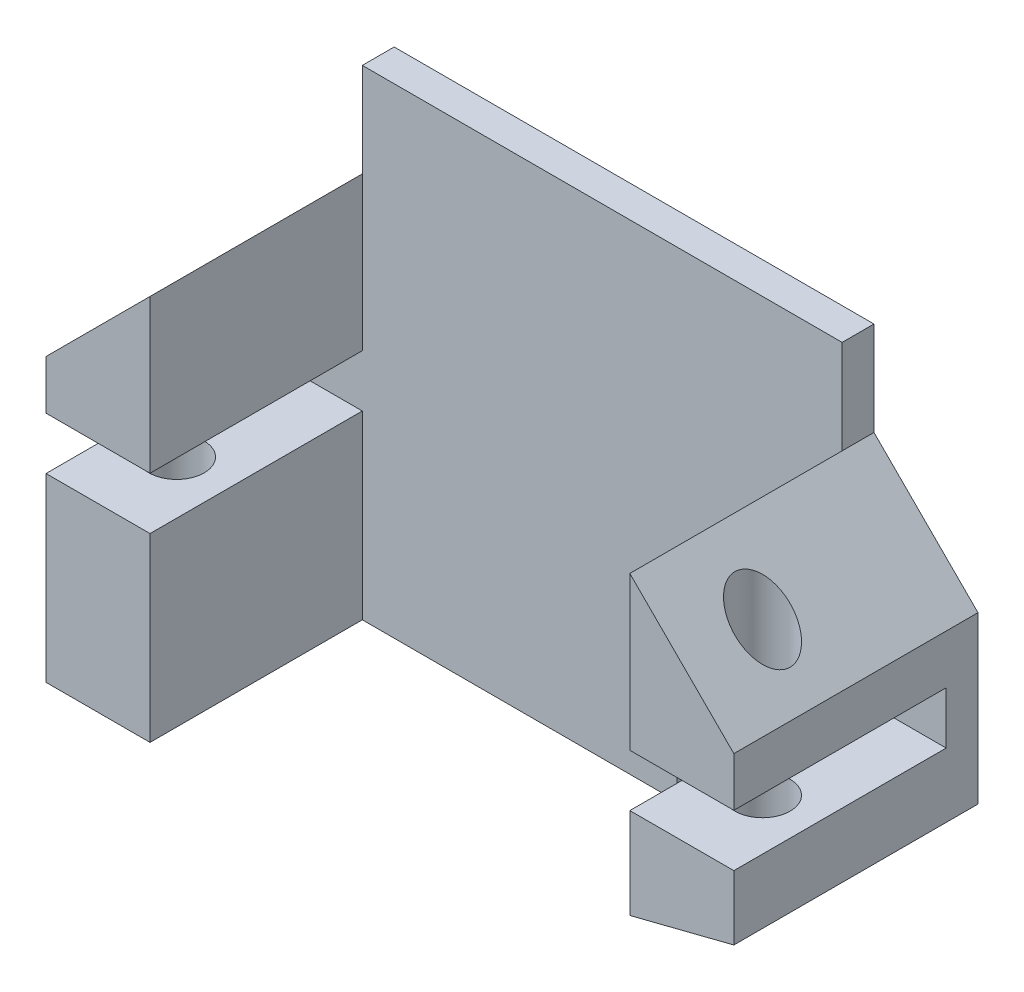
ISO-10303-21;
HEADER;
FILE_DESCRIPTION(('STEP AP214'),'2;1');
FILE_NAME('part.step','',(''),(''),'','','');
FILE_SCHEMA(('AUTOMOTIVE_DESIGN { 1 0 10303 214 1 1 1 1 }'));
ENDSEC;
DATA;
#1=APPLICATION_CONTEXT('core data for automotive mechanical design processes');
#2=APPLICATION_PROTOCOL_DEFINITION('international standard','automotive_design',2000,#1);
#3=PRODUCT_CONTEXT('',#1,'mechanical');
#4=PRODUCT('Part','Part','',(#3));
#5=PRODUCT_RELATED_PRODUCT_CATEGORY('part','',(#4));
#6=PRODUCT_DEFINITION_FORMATION('','',#4);
#7=PRODUCT_DEFINITION_CONTEXT('part definition',#1,'design');
#8=PRODUCT_DEFINITION('design','',#6,#7);
#9=PRODUCT_DEFINITION_SHAPE('','',#8);
#10=(LENGTH_UNIT() NAMED_UNIT(*) SI_UNIT(.MILLI.,.METRE.));
#11=(NAMED_UNIT(*) PLANE_ANGLE_UNIT() SI_UNIT($,.RADIAN.));
#12=(NAMED_UNIT(*) SI_UNIT($,.STERADIAN.) SOLID_ANGLE_UNIT());
#13=UNCERTAINTY_MEASURE_WITH_UNIT(LENGTH_MEASURE(1.E-05),#10,'distance_accuracy_value','');
#14=(GEOMETRIC_REPRESENTATION_CONTEXT(3) GLOBAL_UNCERTAINTY_ASSIGNED_CONTEXT((#13)) GLOBAL_UNIT_ASSIGNED_CONTEXT((#10,
#11,#12)) REPRESENTATION_CONTEXT('',''));
#15=CARTESIAN_POINT('',(0.,0.,0.));
#16=DIRECTION('',(0.,0.,1.));
#17=DIRECTION('',(1.,0.,0.));
#18=AXIS2_PLACEMENT_3D('',#15,#16,#17);
#19=CARTESIAN_POINT('',(0.,0.,1.5));
#20=DIRECTION('',(0.,0.,-1.));
#21=DIRECTION('',(-1.,0.,0.));
#22=AXIS2_PLACEMENT_3D('',#19,#20,#21);
#23=PLANE('',#22);
#24=DIRECTION('',(0.,1.,0.));
#25=VECTOR('',#24,1.);
#26=CARTESIAN_POINT('',(-11.6626752684509,-5.48519949491011,1.5));
#27=LINE('',#26,#25);
#28=CARTESIAN_POINT('',(-11.6626752684509,-5.48519949491011,1.5));
#29=VERTEX_POINT('',#28);
#30=CARTESIAN_POINT('',(-11.6626752684509,3.03480050508989,1.5));
#31=VERTEX_POINT('',#30);
#32=EDGE_CURVE('E351',#29,#31,#27,.T.);
#33=ORIENTED_EDGE('',*,*,#32,.F.);
#34=DIRECTION('',(-1.,0.,0.));
#35=VECTOR('',#34,1.);
#36=CARTESIAN_POINT('',(-16.5626752684509,-5.48519949491011,1.5));
#37=LINE('',#36,#35);
#38=CARTESIAN_POINT('',(3.15732473154912,-5.48519949491011,1.5));
#39=VERTEX_POINT('',#38);
#40=EDGE_CURVE('E270',#39,#29,#37,.T.);
#41=ORIENTED_EDGE('',*,*,#40,.F.);
#42=DIRECTION('',(0.,-1.,0.));
#43=VECTOR('',#42,1.);
#44=CARTESIAN_POINT('',(3.15732473154912,-5.48519949491011,1.5));
#45=LINE('',#44,#43);
#46=CARTESIAN_POINT('',(3.15732473154912,-1.24519949491011,1.5));
#47=VERTEX_POINT('',#46);
#48=EDGE_CURVE('E267',#47,#39,#45,.T.);
#49=ORIENTED_EDGE('',*,*,#48,.F.);
#50=DIRECTION('',(-1.,0.,0.));
#51=VECTOR('',#50,1.);
#52=CARTESIAN_POINT('',(3.15732473154912,-1.24519949491011,1.5));
#53=LINE('',#52,#51);
#54=CARTESIAN_POINT('',(10.9373247315491,-1.24519949491011,1.5));
#55=VERTEX_POINT('',#54);
#56=EDGE_CURVE('E261',#55,#47,#53,.T.);
#57=ORIENTED_EDGE('',*,*,#56,.F.);
#58=DIRECTION('',(0.,-1.,0.));
#59=VECTOR('',#58,1.);
#60=CARTESIAN_POINT('',(10.9373247315491,-1.24519949491012,1.5));
#61=LINE('',#60,#59);
#62=CARTESIAN_POINT('',(10.9373247315491,3.03480050508989,1.5));
#63=VERTEX_POINT('',#62);
#64=EDGE_CURVE('E53',#63,#55,#61,.T.);
#65=ORIENTED_EDGE('',*,*,#64,.F.);
#66=DIRECTION('',(-1.,0.,0.));
#67=VECTOR('',#66,1.);
#68=CARTESIAN_POINT('',(10.9373247315491,3.03480050508989,1.5));
#69=LINE('',#68,#67);
#70=CARTESIAN_POINT('',(15.8373247315491,3.03480050508989,1.5));
#71=VERTEX_POINT('',#70);
#72=EDGE_CURVE('E285',#71,#63,#69,.T.);
#73=ORIENTED_EDGE('',*,*,#72,.F.);
#74=DIRECTION('',(0.,1.,0.));
#75=VECTOR('',#74,1.);
#76=CARTESIAN_POINT('',(15.8373247315491,-12.866571206846,1.5));
#77=LINE('',#76,#75);
#78=CARTESIAN_POINT('',(15.8373247315491,5.49480050508989,1.5));
#79=VERTEX_POINT('',#78);
#80=EDGE_CURVE('E210',#71,#79,#77,.T.);
#81=ORIENTED_EDGE('',*,*,#80,.T.);
#82=DIRECTION('',(1.,0.,0.));
#83=VECTOR('',#82,1.);
#84=CARTESIAN_POINT('',(15.8373247315491,5.49480050508989,1.5));
#85=LINE('',#84,#83);
#86=CARTESIAN_POINT('',(10.9373247315491,5.49480050508989,1.5));
#87=VERTEX_POINT('',#86);
#88=EDGE_CURVE('E60',#87,#79,#85,.T.);
#89=ORIENTED_EDGE('',*,*,#88,.F.);
#90=DIRECTION('',(0.,-1.,0.));
#91=VECTOR('',#90,1.);
#92=CARTESIAN_POINT('',(10.9373247315491,5.49480050508989,1.5));
#93=LINE('',#92,#91);
#94=CARTESIAN_POINT('',(10.9373247315491,12.7081269401292,1.5));
#95=VERTEX_POINT('',#94);
#96=EDGE_CURVE('E202',#95,#87,#93,.T.);
#97=ORIENTED_EDGE('',*,*,#96,.F.);
#98=DIRECTION('',(0.,-1.,0.));
#99=VECTOR('',#98,1.);
#100=CARTESIAN_POINT('',(10.9373247315491,12.7081269401292,1.5));
#101=LINE('',#100,#99);
#102=CARTESIAN_POINT('',(10.9373247315491,17.133428793154,1.5));
#103=VERTEX_POINT('',#102);
#104=EDGE_CURVE('E188',#103,#95,#101,.T.);
#105=ORIENTED_EDGE('',*,*,#104,.F.);
#106=DIRECTION('',(-1.,0.,0.));
#107=VECTOR('',#106,1.);
#108=CARTESIAN_POINT('',(-16.5626752684509,17.133428793154,1.5));
#109=LINE('',#108,#107);
#110=CARTESIAN_POINT('',(-11.6626752684509,17.133428793154,1.5));
#111=VERTEX_POINT('',#110);
#112=EDGE_CURVE('E201',#103,#111,#109,.T.);
#113=ORIENTED_EDGE('',*,*,#112,.T.);
#114=DIRECTION('',(0.,1.,0.));
#115=VECTOR('',#114,1.);
#116=CARTESIAN_POINT('',(-11.6626752684509,12.7081269401292,1.5));
#117=LINE('',#116,#115);
#118=CARTESIAN_POINT('',(-11.6626752684509,12.7081269401292,1.5));
#119=VERTEX_POINT('',#118);
#120=EDGE_CURVE('E263',#119,#111,#117,.T.);
#121=ORIENTED_EDGE('',*,*,#120,.F.);
#122=DIRECTION('',(0.,1.,0.));
#123=VECTOR('',#122,1.);
#124=CARTESIAN_POINT('',(-11.6626752684509,5.49480050508989,1.5));
#125=LINE('',#124,#123);
#126=CARTESIAN_POINT('',(-11.6626752684509,5.49480050508989,1.5));
#127=VERTEX_POINT('',#126);
#128=EDGE_CURVE('E330',#127,#119,#125,.T.);
#129=ORIENTED_EDGE('',*,*,#128,.F.);
#130=DIRECTION('',(1.,0.,0.));
#131=VECTOR('',#130,1.);
#132=CARTESIAN_POINT('',(-16.5626752684509,5.49480050508989,1.5));
#133=LINE('',#132,#131);
#134=CARTESIAN_POINT('',(-16.5626752684509,5.49480050508989,1.5));
#135=VERTEX_POINT('',#134);
#136=EDGE_CURVE('E325',#135,#127,#133,.T.);
#137=ORIENTED_EDGE('',*,*,#136,.F.);
#138=DIRECTION('',(0.,-1.,0.));
#139=VECTOR('',#138,1.);
#140=CARTESIAN_POINT('',(-16.5626752684509,-12.866571206846,1.5));
#141=LINE('',#140,#139);
#142=CARTESIAN_POINT('',(-16.5626752684509,3.03480050508989,1.5));
#143=VERTEX_POINT('',#142);
#144=EDGE_CURVE('E215',#135,#143,#141,.T.);
#145=ORIENTED_EDGE('',*,*,#144,.T.);
#146=DIRECTION('',(-1.,0.,0.));
#147=VECTOR('',#146,1.);
#148=CARTESIAN_POINT('',(-16.5626752684509,3.03480050508989,1.5));
#149=LINE('',#148,#147);
#150=EDGE_CURVE('E356',#31,#143,#149,.T.);
#151=ORIENTED_EDGE('',*,*,#150,.F.);
#152=EDGE_LOOP('',(#33,#41,#49,#57,#65,#73,#81,#89,#97,#105,#113,#121,#129,#137,#145,#151));
#153=FACE_BOUND('',#152,.T.);
#154=ADVANCED_FACE('F36',(#153),#23,.F.);
#155=CARTESIAN_POINT('',(-16.5626752684509,-12.866571206846,1.5));
#156=DIRECTION('',(1.,0.,0.));
#157=DIRECTION('',(0.,0.,-1.));
#158=AXIS2_PLACEMENT_3D('',#155,#156,#157);
#159=PLANE('',#158);
#160=DIRECTION('',(0.,-1.,0.));
#161=VECTOR('',#160,1.);
#162=CARTESIAN_POINT('',(-16.5626752684509,-12.866571206846,0.));
#163=LINE('',#162,#161);
#164=CARTESIAN_POINT('',(-16.5626752684509,7.80812694012916,0.));
#165=VERTEX_POINT('',#164);
#166=CARTESIAN_POINT('',(-16.5626752684509,-5.48519949491011,0.));
#167=VERTEX_POINT('',#166);
#168=EDGE_CURVE('E219',#165,#167,#163,.T.);
#169=ORIENTED_EDGE('',*,*,#168,.T.);
#170=DIRECTION('',(0.,0.,-1.));
#171=VECTOR('',#170,1.);
#172=CARTESIAN_POINT('',(-16.5626752684509,-5.48519949491011,11.5));
#173=LINE('',#172,#171);
#174=CARTESIAN_POINT('',(-16.5626752684509,-5.48519949491011,11.5));
#175=VERTEX_POINT('',#174);
#176=EDGE_CURVE('E223',#175,#167,#173,.T.);
#177=ORIENTED_EDGE('',*,*,#176,.F.);
#178=DIRECTION('',(0.,-1.,0.));
#179=VECTOR('',#178,1.);
#180=CARTESIAN_POINT('',(-16.5626752684509,3.03480050508989,11.5));
#181=LINE('',#180,#179);
#182=CARTESIAN_POINT('',(-16.5626752684509,3.03480050508989,11.5));
#183=VERTEX_POINT('',#182);
#184=EDGE_CURVE('E352',#183,#175,#181,.T.);
#185=ORIENTED_EDGE('',*,*,#184,.F.);
#186=DIRECTION('',(0.,0.,-1.));
#187=VECTOR('',#186,1.);
#188=CARTESIAN_POINT('',(-16.5626752684509,3.03480050508989,11.5));
#189=LINE('',#188,#187);
#190=EDGE_CURVE('E362',#183,#143,#189,.T.);
#191=ORIENTED_EDGE('',*,*,#190,.T.);
#192=ORIENTED_EDGE('',*,*,#144,.F.);
#193=DIRECTION('',(0.,0.,-1.));
#194=VECTOR('',#193,1.);
#195=CARTESIAN_POINT('',(-16.5626752684509,5.49480050508989,11.5));
#196=LINE('',#195,#194);
#197=CARTESIAN_POINT('',(-16.5626752684509,5.49480050508989,11.5));
#198=VERTEX_POINT('',#197);
#199=EDGE_CURVE('E348',#198,#135,#196,.T.);
#200=ORIENTED_EDGE('',*,*,#199,.F.);
#201=DIRECTION('',(0.,-1.,0.));
#202=VECTOR('',#201,1.);
#203=CARTESIAN_POINT('',(-16.5626752684509,7.80812694012916,11.5));
#204=LINE('',#203,#202);
#205=CARTESIAN_POINT('',(-16.5626752684509,7.80812694012916,11.5));
#206=VERTEX_POINT('',#205);
#207=EDGE_CURVE('E326',#206,#198,#204,.T.);
#208=ORIENTED_EDGE('',*,*,#207,.F.);
#209=DIRECTION('',(0.,0.,-1.));
#210=VECTOR('',#209,1.);
#211=CARTESIAN_POINT('',(-16.5626752684509,7.80812694012916,11.5));
#212=LINE('',#211,#210);
#213=EDGE_CURVE('E336',#206,#165,#212,.T.);
#214=ORIENTED_EDGE('',*,*,#213,.T.);
#215=EDGE_LOOP('',(#169,#177,#185,#191,#192,#200,#208,#214));
#216=FACE_BOUND('',#215,.T.);
#217=ADVANCED_FACE('F38',(#216),#159,.F.);
#218=CARTESIAN_POINT('',(15.8373247315491,-12.866571206846,1.5));
#219=DIRECTION('',(-1.,0.,0.));
#220=DIRECTION('',(0.,-1.,0.));
#221=AXIS2_PLACEMENT_3D('',#218,#219,#220);
#222=PLANE('',#221);
#223=DIRECTION('',(0.,0.,-1.));
#224=VECTOR('',#223,1.);
#225=CARTESIAN_POINT('',(15.8373247315491,0.,11.5));
#226=LINE('',#225,#224);
#227=CARTESIAN_POINT('',(15.8373247315491,0.,11.5));
#228=VERTEX_POINT('',#227);
#229=CARTESIAN_POINT('',(15.8373247315491,0.,0.));
#230=VERTEX_POINT('',#229);
#231=EDGE_CURVE('E299',#228,#230,#226,.T.);
#232=ORIENTED_EDGE('',*,*,#231,.T.);
#233=DIRECTION('',(0.,1.,0.));
#234=VECTOR('',#233,1.);
#235=CARTESIAN_POINT('',(15.8373247315491,-12.866571206846,0.));
#236=LINE('',#235,#234);
#237=CARTESIAN_POINT('',(15.8373247315491,7.80812694012933,0.));
#238=VERTEX_POINT('',#237);
#239=EDGE_CURVE('E222',#230,#238,#236,.T.);
#240=ORIENTED_EDGE('',*,*,#239,.T.);
#241=DIRECTION('',(0.,0.,-1.));
#242=VECTOR('',#241,1.);
#243=CARTESIAN_POINT('',(15.8373247315491,7.80812694012931,11.5));
#244=LINE('',#243,#242);
#245=CARTESIAN_POINT('',(15.8373247315491,7.80812694012931,11.5));
#246=VERTEX_POINT('',#245);
#247=EDGE_CURVE('E320',#246,#238,#244,.T.);
#248=ORIENTED_EDGE('',*,*,#247,.F.);
#249=DIRECTION('',(0.,1.,0.));
#250=VECTOR('',#249,1.);
#251=CARTESIAN_POINT('',(15.8373247315491,7.80812694012931,11.5));
#252=LINE('',#251,#250);
#253=CARTESIAN_POINT('',(15.8373247315491,5.49480050508989,11.5));
#254=VERTEX_POINT('',#253);
#255=EDGE_CURVE('E307',#254,#246,#252,.T.);
#256=ORIENTED_EDGE('',*,*,#255,.F.);
#257=DIRECTION('',(0.,0.,-1.));
#258=VECTOR('',#257,1.);
#259=CARTESIAN_POINT('',(15.8373247315491,5.49480050508989,11.5));
#260=LINE('',#259,#258);
#261=EDGE_CURVE('E322',#254,#79,#260,.T.);
#262=ORIENTED_EDGE('',*,*,#261,.T.);
#263=ORIENTED_EDGE('',*,*,#80,.F.);
#264=DIRECTION('',(0.,0.,-1.));
#265=VECTOR('',#264,1.);
#266=CARTESIAN_POINT('',(15.8373247315491,3.03480050508989,11.5));
#267=LINE('',#266,#265);
#268=CARTESIAN_POINT('',(15.8373247315491,3.03480050508989,11.5));
#269=VERTEX_POINT('',#268);
#270=EDGE_CURVE('E296',#269,#71,#267,.T.);
#271=ORIENTED_EDGE('',*,*,#270,.F.);
#272=DIRECTION('',(0.,1.,0.));
#273=VECTOR('',#272,1.);
#274=CARTESIAN_POINT('',(15.8373247315491,3.03480050508989,11.5));
#275=LINE('',#274,#273);
#276=EDGE_CURVE('E287',#228,#269,#275,.T.);
#277=ORIENTED_EDGE('',*,*,#276,.F.);
#278=EDGE_LOOP('',(#232,#240,#248,#256,#262,#263,#271,#277));
#279=FACE_BOUND('',#278,.T.);
#280=ADVANCED_FACE('F420',(#279),#222,.F.);
#281=CARTESIAN_POINT('',(-16.5626752684509,17.133428793154,1.5));
#282=DIRECTION('',(0.,-1.,0.));
#283=DIRECTION('',(0.,0.,-1.));
#284=AXIS2_PLACEMENT_3D('',#281,#282,#283);
#285=PLANE('',#284);
#286=ORIENTED_EDGE('',*,*,#112,.F.);
#287=DIRECTION('',(0.,0.,1.));
#288=VECTOR('',#287,1.);
#289=CARTESIAN_POINT('',(10.9373247315491,17.133428793154,-10.));
#290=LINE('',#289,#288);
#291=CARTESIAN_POINT('',(10.9373247315491,17.133428793154,0.));
#292=VERTEX_POINT('',#291);
#293=EDGE_CURVE('E184',#292,#103,#290,.T.);
#294=ORIENTED_EDGE('',*,*,#293,.F.);
#295=DIRECTION('',(-1.,0.,0.));
#296=VECTOR('',#295,1.);
#297=CARTESIAN_POINT('',(-16.5626752684509,17.133428793154,0.));
#298=LINE('',#297,#296);
#299=CARTESIAN_POINT('',(-11.6626752684509,17.133428793154,0.));
#300=VERTEX_POINT('',#299);
#301=EDGE_CURVE('E226',#292,#300,#298,.T.);
#302=ORIENTED_EDGE('',*,*,#301,.T.);
#303=DIRECTION('',(0.,0.,1.));
#304=VECTOR('',#303,1.);
#305=CARTESIAN_POINT('',(-11.6626752684509,17.133428793154,-10.));
#306=LINE('',#305,#304);
#307=EDGE_CURVE('E208',#300,#111,#306,.T.);
#308=ORIENTED_EDGE('',*,*,#307,.T.);
#309=EDGE_LOOP('',(#286,#294,#302,#308));
#310=FACE_BOUND('',#309,.T.);
#311=ADVANCED_FACE('F207',(#310),#285,.F.);
#312=CARTESIAN_POINT('',(0.,0.,0.));
#313=DIRECTION('',(0.,0.,-1.));
#314=DIRECTION('',(-1.,0.,0.));
#315=AXIS2_PLACEMENT_3D('',#312,#313,#314);
#316=PLANE('',#315);
#317=DIRECTION('',(1.,0.,0.));
#318=VECTOR('',#317,1.);
#319=CARTESIAN_POINT('',(0.,-5.48519949491011,0.));
#320=LINE('',#319,#318);
#321=CARTESIAN_POINT('',(3.15732473154912,-5.48519949491011,0.));
#322=VERTEX_POINT('',#321);
#323=EDGE_CURVE('E11',#167,#322,#320,.T.);
#324=ORIENTED_EDGE('',*,*,#323,.F.);
#325=ORIENTED_EDGE('',*,*,#168,.F.);
#326=DIRECTION('',(-0.707106781186542,-0.707106781186553,0.));
#327=VECTOR('',#326,1.);
#328=CARTESIAN_POINT('',(-12.1854011042902,12.18540110429,0.));
#329=LINE('',#328,#327);
#330=CARTESIAN_POINT('',(-11.6626752684509,12.7081269401292,0.));
#331=VERTEX_POINT('',#330);
#332=EDGE_CURVE('E209',#331,#165,#329,.T.);
#333=ORIENTED_EDGE('',*,*,#332,.F.);
#334=DIRECTION('',(0.,-1.,0.));
#335=VECTOR('',#334,1.);
#336=CARTESIAN_POINT('',(-11.6626752684509,0.,0.));
#337=LINE('',#336,#335);
#338=EDGE_CURVE('E213',#300,#331,#337,.T.);
#339=ORIENTED_EDGE('',*,*,#338,.F.);
#340=ORIENTED_EDGE('',*,*,#301,.F.);
#341=DIRECTION('',(0.,1.,0.));
#342=VECTOR('',#341,1.);
#343=CARTESIAN_POINT('',(10.9373247315491,0.,0.));
#344=LINE('',#343,#342);
#345=CARTESIAN_POINT('',(10.9373247315491,12.7081269401292,0.));
#346=VERTEX_POINT('',#345);
#347=EDGE_CURVE('E191',#346,#292,#344,.T.);
#348=ORIENTED_EDGE('',*,*,#347,.F.);
#349=DIRECTION('',(-0.707106781186553,0.707106781186542,0.));
#350=VECTOR('',#349,1.);
#351=CARTESIAN_POINT('',(11.8227258358391,11.8227258358393,0.));
#352=LINE('',#351,#350);
#353=EDGE_CURVE('E230',#238,#346,#352,.T.);
#354=ORIENTED_EDGE('',*,*,#353,.F.);
#355=ORIENTED_EDGE('',*,*,#239,.F.);
#356=DIRECTION('',(0.969195128328733,0.246294139645771,0.));
#357=VECTOR('',#356,1.);
#358=CARTESIAN_POINT('',(0.96070483913272,-3.78048154612379,0.));
#359=LINE('',#358,#357);
#360=CARTESIAN_POINT('',(10.9373247315491,-1.24519949491011,0.));
#361=VERTEX_POINT('',#360);
#362=EDGE_CURVE('E232',#361,#230,#359,.T.);
#363=ORIENTED_EDGE('',*,*,#362,.F.);
#364=DIRECTION('',(1.,0.,0.));
#365=VECTOR('',#364,1.);
#366=CARTESIAN_POINT('',(0.,-1.24519949491011,0.));
#367=LINE('',#366,#365);
#368=CARTESIAN_POINT('',(3.15732473154912,-1.24519949491011,0.));
#369=VERTEX_POINT('',#368);
#370=EDGE_CURVE('E235',#369,#361,#367,.T.);
#371=ORIENTED_EDGE('',*,*,#370,.F.);
#372=DIRECTION('',(0.,1.,0.));
#373=VECTOR('',#372,1.);
#374=CARTESIAN_POINT('',(3.15732473154912,0.,0.));
#375=LINE('',#374,#373);
#376=EDGE_CURVE('E45',#322,#369,#375,.T.);
#377=ORIENTED_EDGE('',*,*,#376,.F.);
#378=EDGE_LOOP('',(#324,#325,#333,#339,#340,#348,#354,#355,#363,#371,#377));
#379=FACE_BOUND('',#378,.T.);
#380=ADVANCED_FACE('F435',(#379),#316,.T.);
#381=CARTESIAN_POINT('',(-16.5626752684509,-5.48519949491011,11.5));
#382=DIRECTION('',(0.,1.,0.));
#383=DIRECTION('',(0.,0.,1.));
#384=AXIS2_PLACEMENT_3D('',#381,#382,#383);
#385=PLANE('',#384);
#386=CARTESIAN_POINT('',(-14.1626752684509,-5.48519949491011,7.75000000000001));
#387=DIRECTION('',(0.,-1.,0.));
#388=DIRECTION('',(0.,0.,-1.));
#389=AXIS2_PLACEMENT_3D('',#386,#387,#388);
#390=CIRCLE('',#389,1.3);
#391=CARTESIAN_POINT('',(-14.1626752684509,-5.48519949491011,6.45000000000001));
#392=VERTEX_POINT('',#391);
#393=EDGE_CURVE('E240',#392,#392,#390,.T.);
#394=ORIENTED_EDGE('',*,*,#393,.F.);
#395=EDGE_LOOP('',(#394));
#396=FACE_BOUND('',#395,.T.);
#397=ORIENTED_EDGE('',*,*,#176,.T.);
#398=ORIENTED_EDGE('',*,*,#323,.T.);
#399=DIRECTION('',(0.,0.,1.));
#400=VECTOR('',#399,1.);
#401=CARTESIAN_POINT('',(3.15732473154912,-5.48519949491011,-10.));
#402=LINE('',#401,#400);
#403=EDGE_CURVE('E204',#322,#39,#402,.T.);
#404=ORIENTED_EDGE('',*,*,#403,.T.);
#405=ORIENTED_EDGE('',*,*,#40,.T.);
#406=DIRECTION('',(0.,0.,-1.));
#407=VECTOR('',#406,1.);
#408=CARTESIAN_POINT('',(-11.6626752684509,-5.48519949491011,11.5));
#409=LINE('',#408,#407);
#410=CARTESIAN_POINT('',(-11.6626752684509,-5.48519949491011,11.5));
#411=VERTEX_POINT('',#410);
#412=EDGE_CURVE('E372',#411,#29,#409,.T.);
#413=ORIENTED_EDGE('',*,*,#412,.F.);
#414=DIRECTION('',(1.,0.,0.));
#415=VECTOR('',#414,1.);
#416=CARTESIAN_POINT('',(-16.5626752684509,-5.48519949491011,11.5));
#417=LINE('',#416,#415);
#418=EDGE_CURVE('E355',#175,#411,#417,.T.);
#419=ORIENTED_EDGE('',*,*,#418,.F.);
#420=EDGE_LOOP('',(#397,#398,#404,#405,#413,#419));
#421=FACE_BOUND('',#420,.T.);
#422=ADVANCED_FACE('F394',(#396,#421),#385,.F.);
#423=CARTESIAN_POINT('',(-11.6626752684509,-5.48519949491011,11.5));
#424=DIRECTION('',(-1.,0.,0.));
#425=DIRECTION('',(0.,-1.,0.));
#426=AXIS2_PLACEMENT_3D('',#423,#424,#425);
#427=PLANE('',#426);
#428=ORIENTED_EDGE('',*,*,#32,.T.);
#429=DIRECTION('',(0.,0.,-1.));
#430=VECTOR('',#429,1.);
#431=CARTESIAN_POINT('',(-11.6626752684509,3.03480050508989,11.5));
#432=LINE('',#431,#430);
#433=CARTESIAN_POINT('',(-11.6626752684509,3.03480050508989,11.5));
#434=VERTEX_POINT('',#433);
#435=EDGE_CURVE('E369',#434,#31,#432,.T.);
#436=ORIENTED_EDGE('',*,*,#435,.F.);
#437=DIRECTION('',(0.,1.,0.));
#438=VECTOR('',#437,1.);
#439=CARTESIAN_POINT('',(-11.6626752684509,-5.48519949491011,11.5));
#440=LINE('',#439,#438);
#441=EDGE_CURVE('E358',#411,#434,#440,.T.);
#442=ORIENTED_EDGE('',*,*,#441,.F.);
#443=ORIENTED_EDGE('',*,*,#412,.T.);
#444=EDGE_LOOP('',(#428,#436,#442,#443));
#445=FACE_BOUND('',#444,.T.);
#446=ADVANCED_FACE('F390',(#445),#427,.F.);
#447=CARTESIAN_POINT('',(-16.5626752684509,3.03480050508989,11.5));
#448=DIRECTION('',(0.,-1.,0.));
#449=DIRECTION('',(0.,0.,-1.));
#450=AXIS2_PLACEMENT_3D('',#447,#448,#449);
#451=PLANE('',#450);
#452=CARTESIAN_POINT('',(-14.1626752684509,3.03480050508989,7.75000000000001));
#453=DIRECTION('',(0.,-1.,0.));
#454=DIRECTION('',(0.,0.,-1.));
#455=AXIS2_PLACEMENT_3D('',#452,#453,#454);
#456=CIRCLE('',#455,1.3);
#457=CARTESIAN_POINT('',(-14.1626752684509,3.03480050508989,6.45000000000001));
#458=VERTEX_POINT('',#457);
#459=EDGE_CURVE('E259',#458,#458,#456,.T.);
#460=ORIENTED_EDGE('',*,*,#459,.T.);
#461=EDGE_LOOP('',(#460));
#462=FACE_BOUND('',#461,.T.);
#463=ORIENTED_EDGE('',*,*,#150,.T.);
#464=ORIENTED_EDGE('',*,*,#190,.F.);
#465=DIRECTION('',(-1.,0.,0.));
#466=VECTOR('',#465,1.);
#467=CARTESIAN_POINT('',(-16.5626752684509,3.03480050508989,11.5));
#468=LINE('',#467,#466);
#469=EDGE_CURVE('E360',#434,#183,#468,.T.);
#470=ORIENTED_EDGE('',*,*,#469,.F.);
#471=ORIENTED_EDGE('',*,*,#435,.T.);
#472=EDGE_LOOP('',(#463,#464,#470,#471));
#473=FACE_BOUND('',#472,.T.);
#474=ADVANCED_FACE('F380',(#462,#473),#451,.F.);
#475=CARTESIAN_POINT('',(0.,0.,11.5));
#476=DIRECTION('',(0.,0.,1.));
#477=DIRECTION('',(1.,0.,0.));
#478=AXIS2_PLACEMENT_3D('',#475,#476,#477);
#479=PLANE('',#478);
#480=ORIENTED_EDGE('',*,*,#184,.T.);
#481=ORIENTED_EDGE('',*,*,#418,.T.);
#482=ORIENTED_EDGE('',*,*,#441,.T.);
#483=ORIENTED_EDGE('',*,*,#469,.T.);
#484=EDGE_LOOP('',(#480,#481,#482,#483));
#485=FACE_BOUND('',#484,.T.);
#486=ADVANCED_FACE('F386',(#485),#479,.T.);
#487=CARTESIAN_POINT('',(-16.5626752684509,5.49480050508989,11.5));
#488=DIRECTION('',(0.,1.,0.));
#489=DIRECTION('',(0.,0.,1.));
#490=AXIS2_PLACEMENT_3D('',#487,#488,#489);
#491=PLANE('',#490);
#492=CARTESIAN_POINT('',(-14.1626752684509,5.49480050508989,7.75000000000001));
#493=DIRECTION('',(0.,1.,0.));
#494=DIRECTION('',(0.,0.,1.));
#495=AXIS2_PLACEMENT_3D('',#492,#493,#494);
#496=CIRCLE('',#495,1.3);
#497=CARTESIAN_POINT('',(-14.1626752684509,5.49480050508989,9.05));
#498=VERTEX_POINT('',#497);
#499=EDGE_CURVE('E256',#498,#498,#496,.T.);
#500=ORIENTED_EDGE('',*,*,#499,.T.);
#501=EDGE_LOOP('',(#500));
#502=FACE_BOUND('',#501,.T.);
#503=ORIENTED_EDGE('',*,*,#136,.T.);
#504=DIRECTION('',(0.,0.,-1.));
#505=VECTOR('',#504,1.);
#506=CARTESIAN_POINT('',(-11.6626752684509,5.49480050508989,11.5));
#507=LINE('',#506,#505);
#508=CARTESIAN_POINT('',(-11.6626752684509,5.49480050508989,11.5));
#509=VERTEX_POINT('',#508);
#510=EDGE_CURVE('E345',#509,#127,#507,.T.);
#511=ORIENTED_EDGE('',*,*,#510,.F.);
#512=DIRECTION('',(1.,0.,0.));
#513=VECTOR('',#512,1.);
#514=CARTESIAN_POINT('',(-16.5626752684509,5.49480050508989,11.5));
#515=LINE('',#514,#513);
#516=EDGE_CURVE('E329',#198,#509,#515,.T.);
#517=ORIENTED_EDGE('',*,*,#516,.F.);
#518=ORIENTED_EDGE('',*,*,#199,.T.);
#519=EDGE_LOOP('',(#503,#511,#517,#518));
#520=FACE_BOUND('',#519,.T.);
#521=ADVANCED_FACE('F453',(#502,#520),#491,.F.);
#522=CARTESIAN_POINT('',(-11.6626752684509,5.49480050508989,11.5));
#523=DIRECTION('',(-1.,0.,0.));
#524=DIRECTION('',(0.,-1.,0.));
#525=AXIS2_PLACEMENT_3D('',#522,#523,#524);
#526=PLANE('',#525);
#527=ORIENTED_EDGE('',*,*,#128,.T.);
#528=DIRECTION('',(0.,0.,-1.));
#529=VECTOR('',#528,1.);
#530=CARTESIAN_POINT('',(-11.6626752684509,12.7081269401292,11.5));
#531=LINE('',#530,#529);
#532=CARTESIAN_POINT('',(-11.6626752684509,12.7081269401292,11.5));
#533=VERTEX_POINT('',#532);
#534=EDGE_CURVE('E342',#533,#119,#531,.T.);
#535=ORIENTED_EDGE('',*,*,#534,.F.);
#536=DIRECTION('',(0.,1.,0.));
#537=VECTOR('',#536,1.);
#538=CARTESIAN_POINT('',(-11.6626752684509,5.49480050508989,11.5));
#539=LINE('',#538,#537);
#540=EDGE_CURVE('E332',#509,#533,#539,.T.);
#541=ORIENTED_EDGE('',*,*,#540,.F.);
#542=ORIENTED_EDGE('',*,*,#510,.T.);
#543=EDGE_LOOP('',(#527,#535,#541,#542));
#544=FACE_BOUND('',#543,.T.);
#545=ADVANCED_FACE('F450',(#544),#526,.F.);
#546=CARTESIAN_POINT('',(-11.6626752684509,12.7081269401292,11.5));
#547=DIRECTION('',(0.707106781186553,-0.707106781186542,0.));
#548=DIRECTION('',(0.707106781186542,0.707106781186553,0.));
#549=AXIS2_PLACEMENT_3D('',#546,#547,#548);
#550=PLANE('',#549);
#551=CARTESIAN_POINT('',(-14.1626752684509,10.2081269401292,7.75000000000001));
#552=DIRECTION('',(0.707106781186553,-0.707106781186542,0.));
#553=DIRECTION('',(-0.707106781186542,-0.707106781186553,0.));
#554=AXIS2_PLACEMENT_3D('',#551,#552,#553);
#555=ELLIPSE('',#554,1.83847763108503,1.3);
#556=CARTESIAN_POINT('',(-15.4626752684509,8.90812694012918,7.75000000000001));
#557=VERTEX_POINT('',#556);
#558=EDGE_CURVE('E40',#557,#557,#555,.T.);
#559=ORIENTED_EDGE('',*,*,#558,.T.);
#560=EDGE_LOOP('',(#559));
#561=FACE_BOUND('',#560,.T.);
#562=ORIENTED_EDGE('',*,*,#534,.T.);
#563=DIRECTION('',(0.,0.,1.));
#564=VECTOR('',#563,1.);
#565=CARTESIAN_POINT('',(-11.6626752684509,12.7081269401292,-10.));
#566=LINE('',#565,#564);
#567=EDGE_CURVE('E278',#331,#119,#566,.T.);
#568=ORIENTED_EDGE('',*,*,#567,.F.);
#569=ORIENTED_EDGE('',*,*,#332,.T.);
#570=ORIENTED_EDGE('',*,*,#213,.F.);
#571=DIRECTION('',(-0.707106781186542,-0.707106781186553,0.));
#572=VECTOR('',#571,1.);
#573=CARTESIAN_POINT('',(-11.6626752684509,12.7081269401292,11.5));
#574=LINE('',#573,#572);
#575=EDGE_CURVE('E334',#533,#206,#574,.T.);
#576=ORIENTED_EDGE('',*,*,#575,.F.);
#577=EDGE_LOOP('',(#562,#568,#569,#570,#576));
#578=FACE_BOUND('',#577,.T.);
#579=ADVANCED_FACE('F444',(#561,#578),#550,.F.);
#580=CARTESIAN_POINT('',(0.,0.,11.5));
#581=DIRECTION('',(0.,0.,1.));
#582=DIRECTION('',(1.,0.,0.));
#583=AXIS2_PLACEMENT_3D('',#580,#581,#582);
#584=PLANE('',#583);
#585=ORIENTED_EDGE('',*,*,#207,.T.);
#586=ORIENTED_EDGE('',*,*,#516,.T.);
#587=ORIENTED_EDGE('',*,*,#540,.T.);
#588=ORIENTED_EDGE('',*,*,#575,.T.);
#589=EDGE_LOOP('',(#585,#586,#587,#588));
#590=FACE_BOUND('',#589,.T.);
#591=ADVANCED_FACE('F456',(#590),#584,.T.);
#592=CARTESIAN_POINT('',(15.8373247315491,5.49480050508989,11.5));
#593=DIRECTION('',(0.,1.,0.));
#594=DIRECTION('',(0.,0.,1.));
#595=AXIS2_PLACEMENT_3D('',#592,#593,#594);
#596=PLANE('',#595);
#597=CARTESIAN_POINT('',(13.4373247315491,5.49480050508989,7.75000000000001));
#598=DIRECTION('',(0.,1.,0.));
#599=DIRECTION('',(0.,0.,1.));
#600=AXIS2_PLACEMENT_3D('',#597,#598,#599);
#601=CIRCLE('',#600,1.3);
#602=CARTESIAN_POINT('',(13.4373247315491,5.49480050508989,9.05000000000001));
#603=VERTEX_POINT('',#602);
#604=EDGE_CURVE('E253',#603,#603,#601,.T.);
#605=ORIENTED_EDGE('',*,*,#604,.T.);
#606=EDGE_LOOP('',(#605));
#607=FACE_BOUND('',#606,.T.);
#608=ORIENTED_EDGE('',*,*,#88,.T.);
#609=ORIENTED_EDGE('',*,*,#261,.F.);
#610=DIRECTION('',(1.,0.,0.));
#611=VECTOR('',#610,1.);
#612=CARTESIAN_POINT('',(15.8373247315491,5.49480050508989,11.5));
#613=LINE('',#612,#611);
#614=CARTESIAN_POINT('',(10.9373247315491,5.49480050508989,11.5));
#615=VERTEX_POINT('',#614);
#616=EDGE_CURVE('E304',#615,#254,#613,.T.);
#617=ORIENTED_EDGE('',*,*,#616,.F.);
#618=DIRECTION('',(0.,0.,-1.));
#619=VECTOR('',#618,1.);
#620=CARTESIAN_POINT('',(10.9373247315491,5.49480050508989,11.5));
#621=LINE('',#620,#619);
#622=EDGE_CURVE('E313',#615,#87,#621,.T.);
#623=ORIENTED_EDGE('',*,*,#622,.T.);
#624=EDGE_LOOP('',(#608,#609,#617,#623));
#625=FACE_BOUND('',#624,.T.);
#626=ADVANCED_FACE('F424',(#607,#625),#596,.F.);
#627=CARTESIAN_POINT('',(10.9373247315491,12.7081269401292,11.5));
#628=DIRECTION('',(-0.707106781186542,-0.707106781186553,0.));
#629=DIRECTION('',(0.707106781186553,-0.707106781186542,0.));
#630=AXIS2_PLACEMENT_3D('',#627,#628,#629);
#631=PLANE('',#630);
#632=CARTESIAN_POINT('',(13.4373247315491,10.2081269401293,7.75000000000001));
#633=DIRECTION('',(-0.707106781186542,-0.707106781186553,0.));
#634=DIRECTION('',(0.707106781186553,-0.707106781186542,0.));
#635=AXIS2_PLACEMENT_3D('',#632,#633,#634);
#636=ELLIPSE('',#635,1.83847763108501,1.3);
#637=CARTESIAN_POINT('',(14.7373247315491,8.9081269401293,7.75000000000001));
#638=VERTEX_POINT('',#637);
#639=EDGE_CURVE('E244',#638,#638,#636,.T.);
#640=ORIENTED_EDGE('',*,*,#639,.T.);
#641=EDGE_LOOP('',(#640));
#642=FACE_BOUND('',#641,.T.);
#643=ORIENTED_EDGE('',*,*,#247,.T.);
#644=ORIENTED_EDGE('',*,*,#353,.T.);
#645=DIRECTION('',(0.,0.,1.));
#646=VECTOR('',#645,1.);
#647=CARTESIAN_POINT('',(10.9373247315491,12.7081269401292,-10.));
#648=LINE('',#647,#646);
#649=EDGE_CURVE('E196',#346,#95,#648,.T.);
#650=ORIENTED_EDGE('',*,*,#649,.T.);
#651=DIRECTION('',(0.,0.,-1.));
#652=VECTOR('',#651,1.);
#653=CARTESIAN_POINT('',(10.9373247315491,12.7081269401292,11.5));
#654=LINE('',#653,#652);
#655=CARTESIAN_POINT('',(10.9373247315491,12.7081269401292,11.5));
#656=VERTEX_POINT('',#655);
#657=EDGE_CURVE('E318',#656,#95,#654,.T.);
#658=ORIENTED_EDGE('',*,*,#657,.F.);
#659=DIRECTION('',(-0.707106781186553,0.707106781186542,0.));
#660=VECTOR('',#659,1.);
#661=CARTESIAN_POINT('',(10.9373247315491,12.7081269401292,11.5));
#662=LINE('',#661,#660);
#663=EDGE_CURVE('E309',#246,#656,#662,.T.);
#664=ORIENTED_EDGE('',*,*,#663,.F.);
#665=EDGE_LOOP('',(#643,#644,#650,#658,#664));
#666=FACE_BOUND('',#665,.T.);
#667=ADVANCED_FACE('F432',(#642,#666),#631,.F.);
#668=CARTESIAN_POINT('',(10.9373247315491,5.49480050508989,11.5));
#669=DIRECTION('',(1.,0.,0.));
#670=DIRECTION('',(0.,1.,0.));
#671=AXIS2_PLACEMENT_3D('',#668,#669,#670);
#672=PLANE('',#671);
#673=ORIENTED_EDGE('',*,*,#96,.T.);
#674=ORIENTED_EDGE('',*,*,#622,.F.);
#675=DIRECTION('',(0.,-1.,0.));
#676=VECTOR('',#675,1.);
#677=CARTESIAN_POINT('',(10.9373247315491,5.49480050508989,11.5));
#678=LINE('',#677,#676);
#679=EDGE_CURVE('E311',#656,#615,#678,.T.);
#680=ORIENTED_EDGE('',*,*,#679,.F.);
#681=ORIENTED_EDGE('',*,*,#657,.T.);
#682=EDGE_LOOP('',(#673,#674,#680,#681));
#683=FACE_BOUND('',#682,.T.);
#684=ADVANCED_FACE('F428',(#683),#672,.F.);
#685=CARTESIAN_POINT('',(0.,0.,11.5));
#686=DIRECTION('',(0.,0.,-1.));
#687=DIRECTION('',(-1.,0.,0.));
#688=AXIS2_PLACEMENT_3D('',#685,#686,#687);
#689=PLANE('',#688);
#690=ORIENTED_EDGE('',*,*,#616,.T.);
#691=ORIENTED_EDGE('',*,*,#255,.T.);
#692=ORIENTED_EDGE('',*,*,#663,.T.);
#693=ORIENTED_EDGE('',*,*,#679,.T.);
#694=EDGE_LOOP('',(#690,#691,#692,#693));
#695=FACE_BOUND('',#694,.T.);
#696=ADVANCED_FACE('F631',(#695),#689,.F.);
#697=CARTESIAN_POINT('',(10.9373247315491,-1.24519949491012,11.5));
#698=DIRECTION('',(1.,0.,0.));
#699=DIRECTION('',(0.,1.,0.));
#700=AXIS2_PLACEMENT_3D('',#697,#698,#699);
#701=PLANE('',#700);
#702=ORIENTED_EDGE('',*,*,#64,.T.);
#703=DIRECTION('',(0.,0.,-1.));
#704=VECTOR('',#703,1.);
#705=CARTESIAN_POINT('',(10.9373247315491,-1.24519949491012,11.5));
#706=LINE('',#705,#704);
#707=CARTESIAN_POINT('',(10.9373247315491,-1.24519949491012,11.5));
#708=VERTEX_POINT('',#707);
#709=EDGE_CURVE('E301',#708,#55,#706,.T.);
#710=ORIENTED_EDGE('',*,*,#709,.F.);
#711=DIRECTION('',(0.,-1.,0.));
#712=VECTOR('',#711,1.);
#713=CARTESIAN_POINT('',(10.9373247315491,-1.24519949491012,11.5));
#714=LINE('',#713,#712);
#715=CARTESIAN_POINT('',(10.9373247315491,3.03480050508989,11.5));
#716=VERTEX_POINT('',#715);
#717=EDGE_CURVE('E281',#716,#708,#714,.T.);
#718=ORIENTED_EDGE('',*,*,#717,.F.);
#719=DIRECTION('',(0.,0.,-1.));
#720=VECTOR('',#719,1.);
#721=CARTESIAN_POINT('',(10.9373247315491,3.03480050508989,11.5));
#722=LINE('',#721,#720);
#723=EDGE_CURVE('E291',#716,#63,#722,.T.);
#724=ORIENTED_EDGE('',*,*,#723,.T.);
#725=EDGE_LOOP('',(#702,#710,#718,#724));
#726=FACE_BOUND('',#725,.T.);
#727=ADVANCED_FACE('F412',(#726),#701,.F.);
#728=CARTESIAN_POINT('',(15.8373247315491,0.,11.5));
#729=DIRECTION('',(-0.246294139645771,0.969195128328733,0.));
#730=DIRECTION('',(-0.969195128328733,-0.246294139645771,0.));
#731=AXIS2_PLACEMENT_3D('',#728,#729,#730);
#732=PLANE('',#731);
#733=CARTESIAN_POINT('',(13.4373247315491,-0.609893630160056,7.75000000000001));
#734=DIRECTION('',(-0.246294139645771,0.969195128328733,0.));
#735=DIRECTION('',(-0.969195128328733,-0.246294139645771,0.));
#736=AXIS2_PLACEMENT_3D('',#733,#734,#735);
#737=ELLIPSE('',#736,1.34131916474003,1.3);
#738=CARTESIAN_POINT('',(12.1373247315491,-0.940252679830086,7.75000000000001));
#739=VERTEX_POINT('',#738);
#740=EDGE_CURVE('E239',#739,#739,#737,.T.);
#741=ORIENTED_EDGE('',*,*,#740,.T.);
#742=EDGE_LOOP('',(#741));
#743=FACE_BOUND('',#742,.T.);
#744=ORIENTED_EDGE('',*,*,#709,.T.);
#745=DIRECTION('',(0.,0.,1.));
#746=VECTOR('',#745,1.);
#747=CARTESIAN_POINT('',(10.9373247315491,-1.24519949491011,-10.));
#748=LINE('',#747,#746);
#749=EDGE_CURVE('E272',#361,#55,#748,.T.);
#750=ORIENTED_EDGE('',*,*,#749,.F.);
#751=ORIENTED_EDGE('',*,*,#362,.T.);
#752=ORIENTED_EDGE('',*,*,#231,.F.);
#753=DIRECTION('',(0.969195128328733,0.246294139645771,0.));
#754=VECTOR('',#753,1.);
#755=CARTESIAN_POINT('',(15.8373247315491,0.,11.5));
#756=LINE('',#755,#754);
#757=EDGE_CURVE('E284',#708,#228,#756,.T.);
#758=ORIENTED_EDGE('',*,*,#757,.F.);
#759=EDGE_LOOP('',(#744,#750,#751,#752,#758));
#760=FACE_BOUND('',#759,.T.);
#761=ADVANCED_FACE('F407',(#743,#760),#732,.F.);
#762=CARTESIAN_POINT('',(10.9373247315491,3.03480050508989,11.5));
#763=DIRECTION('',(0.,-1.,0.));
#764=DIRECTION('',(0.,0.,-1.));
#765=AXIS2_PLACEMENT_3D('',#762,#763,#764);
#766=PLANE('',#765);
#767=CARTESIAN_POINT('',(13.4373247315491,3.03480050508989,7.75000000000001));
#768=DIRECTION('',(0.,-1.,0.));
#769=DIRECTION('',(0.,0.,-1.));
#770=AXIS2_PLACEMENT_3D('',#767,#768,#769);
#771=CIRCLE('',#770,1.3);
#772=CARTESIAN_POINT('',(13.4373247315491,3.03480050508989,6.45000000000001));
#773=VERTEX_POINT('',#772);
#774=EDGE_CURVE('E237',#773,#773,#771,.T.);
#775=ORIENTED_EDGE('',*,*,#774,.T.);
#776=EDGE_LOOP('',(#775));
#777=FACE_BOUND('',#776,.T.);
#778=ORIENTED_EDGE('',*,*,#72,.T.);
#779=ORIENTED_EDGE('',*,*,#723,.F.);
#780=DIRECTION('',(-1.,0.,0.));
#781=VECTOR('',#780,1.);
#782=CARTESIAN_POINT('',(10.9373247315491,3.03480050508989,11.5));
#783=LINE('',#782,#781);
#784=EDGE_CURVE('E289',#269,#716,#783,.T.);
#785=ORIENTED_EDGE('',*,*,#784,.F.);
#786=ORIENTED_EDGE('',*,*,#270,.T.);
#787=EDGE_LOOP('',(#778,#779,#785,#786));
#788=FACE_BOUND('',#787,.T.);
#789=ADVANCED_FACE('F416',(#777,#788),#766,.F.);
#790=CARTESIAN_POINT('',(0.,0.,11.5));
#791=DIRECTION('',(0.,0.,-1.));
#792=DIRECTION('',(-1.,0.,0.));
#793=AXIS2_PLACEMENT_3D('',#790,#791,#792);
#794=PLANE('',#793);
#795=ORIENTED_EDGE('',*,*,#717,.T.);
#796=ORIENTED_EDGE('',*,*,#757,.T.);
#797=ORIENTED_EDGE('',*,*,#276,.T.);
#798=ORIENTED_EDGE('',*,*,#784,.T.);
#799=EDGE_LOOP('',(#795,#796,#797,#798));
#800=FACE_BOUND('',#799,.T.);
#801=ADVANCED_FACE('F574',(#800),#794,.F.);
#802=CARTESIAN_POINT('',(3.15732473154912,-5.48519949491011,-10.));
#803=DIRECTION('',(-1.,0.,0.));
#804=DIRECTION('',(0.,-1.,0.));
#805=AXIS2_PLACEMENT_3D('',#802,#803,#804);
#806=PLANE('',#805);
#807=ORIENTED_EDGE('',*,*,#376,.T.);
#808=DIRECTION('',(0.,0.,1.));
#809=VECTOR('',#808,1.);
#810=CARTESIAN_POINT('',(3.15732473154912,-1.24519949491011,-10.));
#811=LINE('',#810,#809);
#812=EDGE_CURVE('E274',#369,#47,#811,.T.);
#813=ORIENTED_EDGE('',*,*,#812,.T.);
#814=ORIENTED_EDGE('',*,*,#48,.T.);
#815=ORIENTED_EDGE('',*,*,#403,.F.);
#816=EDGE_LOOP('',(#807,#813,#814,#815));
#817=FACE_BOUND('',#816,.T.);
#818=ADVANCED_FACE('F399',(#817),#806,.F.);
#819=CARTESIAN_POINT('',(3.15732473154912,-1.24519949491011,-10.));
#820=DIRECTION('',(0.,1.,0.));
#821=DIRECTION('',(-1.,0.,0.));
#822=AXIS2_PLACEMENT_3D('',#819,#820,#821);
#823=PLANE('',#822);
#824=ORIENTED_EDGE('',*,*,#370,.T.);
#825=ORIENTED_EDGE('',*,*,#749,.T.);
#826=ORIENTED_EDGE('',*,*,#56,.T.);
#827=ORIENTED_EDGE('',*,*,#812,.F.);
#828=EDGE_LOOP('',(#824,#825,#826,#827));
#829=FACE_BOUND('',#828,.T.);
#830=ADVANCED_FACE('F403',(#829),#823,.F.);
#831=CARTESIAN_POINT('',(10.9373247315491,12.7081269401292,-10.));
#832=DIRECTION('',(-1.,0.,0.));
#833=DIRECTION('',(0.,-1.,0.));
#834=AXIS2_PLACEMENT_3D('',#831,#832,#833);
#835=PLANE('',#834);
#836=ORIENTED_EDGE('',*,*,#347,.T.);
#837=ORIENTED_EDGE('',*,*,#293,.T.);
#838=ORIENTED_EDGE('',*,*,#104,.T.);
#839=ORIENTED_EDGE('',*,*,#649,.F.);
#840=EDGE_LOOP('',(#836,#837,#838,#839));
#841=FACE_BOUND('',#840,.T.);
#842=ADVANCED_FACE('F186',(#841),#835,.F.);
#843=CARTESIAN_POINT('',(-11.6626752684509,12.7081269401292,-10.));
#844=DIRECTION('',(1.,0.,0.));
#845=DIRECTION('',(0.,1.,0.));
#846=AXIS2_PLACEMENT_3D('',#843,#844,#845);
#847=PLANE('',#846);
#848=ORIENTED_EDGE('',*,*,#338,.T.);
#849=ORIENTED_EDGE('',*,*,#567,.T.);
#850=ORIENTED_EDGE('',*,*,#120,.T.);
#851=ORIENTED_EDGE('',*,*,#307,.F.);
#852=EDGE_LOOP('',(#848,#849,#850,#851));
#853=FACE_BOUND('',#852,.T.);
#854=ADVANCED_FACE('F442',(#853),#847,.F.);
#855=CARTESIAN_POINT('',(13.4373247315491,26.0148005050899,7.75000000000001));
#856=DIRECTION('',(0.,-1.,0.));
#857=DIRECTION('',(0.,0.,-1.));
#858=AXIS2_PLACEMENT_3D('',#855,#856,#857);
#859=CYLINDRICAL_SURFACE('',#858,1.3);
#860=ORIENTED_EDGE('',*,*,#774,.F.);
#861=EDGE_LOOP('',(#860));
#862=FACE_BOUND('',#861,.T.);
#863=ORIENTED_EDGE('',*,*,#740,.F.);
#864=EDGE_LOOP('',(#863));
#865=FACE_BOUND('',#864,.T.);
#866=ADVANCED_FACE('F581',(#862,#865),#859,.F.);
#867=ORIENTED_EDGE('',*,*,#639,.F.);
#868=EDGE_LOOP('',(#867));
#869=FACE_BOUND('',#868,.T.);
#870=ORIENTED_EDGE('',*,*,#604,.F.);
#871=EDGE_LOOP('',(#870));
#872=FACE_BOUND('',#871,.T.);
#873=ADVANCED_FACE('F586',(#869,#872),#859,.F.);
#874=CARTESIAN_POINT('',(-14.1626752684509,26.0148005050899,7.75000000000001));
#875=DIRECTION('',(0.,-1.,0.));
#876=DIRECTION('',(0.,0.,-1.));
#877=AXIS2_PLACEMENT_3D('',#874,#875,#876);
#878=CYLINDRICAL_SURFACE('',#877,1.3);
#879=ORIENTED_EDGE('',*,*,#558,.F.);
#880=EDGE_LOOP('',(#879));
#881=FACE_BOUND('',#880,.T.);
#882=ORIENTED_EDGE('',*,*,#499,.F.);
#883=EDGE_LOOP('',(#882));
#884=FACE_BOUND('',#883,.T.);
#885=ADVANCED_FACE('F598',(#881,#884),#878,.F.);
#886=ORIENTED_EDGE('',*,*,#393,.T.);
#887=EDGE_LOOP('',(#886));
#888=FACE_BOUND('',#887,.T.);
#889=ORIENTED_EDGE('',*,*,#459,.F.);
#890=EDGE_LOOP('',(#889));
#891=FACE_BOUND('',#890,.T.);
#892=ADVANCED_FACE('F607',(#888,#891),#878,.F.);
#893=CLOSED_SHELL('',(#154,#217,#280,#311,#380,#422,#446,#474,#486,#521,#545,#579,#591,#626,
#667,#684,#696,#727,#761,#789,#801,#818,#830,#842,#854,#866,#873,#885,#892));
#894=MANIFOLD_SOLID_BREP('B2',#893);
#895=ADVANCED_BREP_SHAPE_REPRESENTATION('',(#18,#894),#14);
#896=SHAPE_DEFINITION_REPRESENTATION(#9,#895);
ENDSEC;
END-ISO-10303-21;
